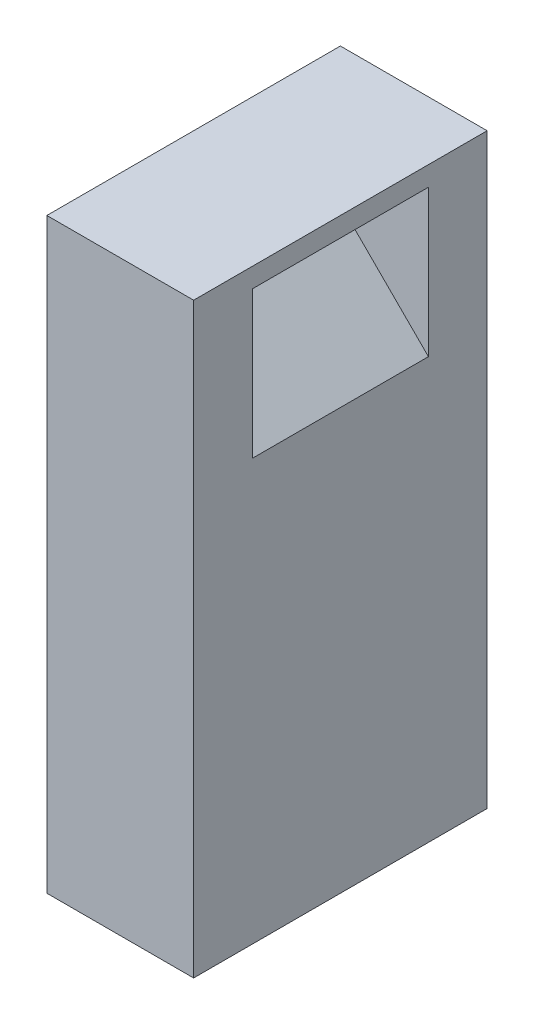
ISO-10303-21;
HEADER;
FILE_DESCRIPTION(('STEP AP214'),'2;1');
FILE_NAME('part.step','',(''),(''),'','','');
FILE_SCHEMA(('AUTOMOTIVE_DESIGN { 1 0 10303 214 1 1 1 1 }'));
ENDSEC;
DATA;
#1=APPLICATION_CONTEXT('core data for automotive mechanical design processes');
#2=APPLICATION_PROTOCOL_DEFINITION('international standard','automotive_design',2000,#1);
#3=PRODUCT_CONTEXT('',#1,'mechanical');
#4=PRODUCT('Part','Part','',(#3));
#5=PRODUCT_RELATED_PRODUCT_CATEGORY('part','',(#4));
#6=PRODUCT_DEFINITION_FORMATION('','',#4);
#7=PRODUCT_DEFINITION_CONTEXT('part definition',#1,'design');
#8=PRODUCT_DEFINITION('design','',#6,#7);
#9=PRODUCT_DEFINITION_SHAPE('','',#8);
#10=(LENGTH_UNIT() NAMED_UNIT(*) SI_UNIT(.MILLI.,.METRE.));
#11=(NAMED_UNIT(*) PLANE_ANGLE_UNIT() SI_UNIT($,.RADIAN.));
#12=(NAMED_UNIT(*) SI_UNIT($,.STERADIAN.) SOLID_ANGLE_UNIT());
#13=UNCERTAINTY_MEASURE_WITH_UNIT(LENGTH_MEASURE(1.E-05),#10,'distance_accuracy_value','');
#14=(GEOMETRIC_REPRESENTATION_CONTEXT(3) GLOBAL_UNCERTAINTY_ASSIGNED_CONTEXT((#13)) GLOBAL_UNIT_ASSIGNED_CONTEXT((#10,
#11,#12)) REPRESENTATION_CONTEXT('',''));
#15=CARTESIAN_POINT('',(0.,0.,0.));
#16=DIRECTION('',(0.,0.,1.));
#17=DIRECTION('',(1.,0.,0.));
#18=AXIS2_PLACEMENT_3D('',#15,#16,#17);
#19=CARTESIAN_POINT('',(75.,0.,75.));
#20=DIRECTION('',(-1.,0.,0.));
#21=DIRECTION('',(0.,0.,1.));
#22=AXIS2_PLACEMENT_3D('',#19,#20,#21);
#23=PLANE('',#22);
#24=DIRECTION('',(0.,1.,0.));
#25=VECTOR('',#24,1.);
#26=CARTESIAN_POINT('',(75.,0.,-75.));
#27=LINE('',#26,#25);
#28=CARTESIAN_POINT('',(75.,0.,-75.));
#29=VERTEX_POINT('',#28);
#30=CARTESIAN_POINT('',(75.,300.,-75.));
#31=VERTEX_POINT('',#30);
#32=EDGE_CURVE('E161',#29,#31,#27,.T.);
#33=ORIENTED_EDGE('',*,*,#32,.T.);
#34=DIRECTION('',(0.,0.,-1.));
#35=VECTOR('',#34,1.);
#36=CARTESIAN_POINT('',(75.,300.,75.));
#37=LINE('',#36,#35);
#38=CARTESIAN_POINT('',(75.,300.,75.));
#39=VERTEX_POINT('',#38);
#40=EDGE_CURVE('E169',#39,#31,#37,.T.);
#41=ORIENTED_EDGE('',*,*,#40,.F.);
#42=DIRECTION('',(0.,1.,0.));
#43=VECTOR('',#42,1.);
#44=CARTESIAN_POINT('',(75.,0.,75.));
#45=LINE('',#44,#43);
#46=CARTESIAN_POINT('',(75.,0.,75.));
#47=VERTEX_POINT('',#46);
#48=EDGE_CURVE('E148',#47,#39,#45,.T.);
#49=ORIENTED_EDGE('',*,*,#48,.F.);
#50=DIRECTION('',(0.,0.,-1.));
#51=VECTOR('',#50,1.);
#52=CARTESIAN_POINT('',(75.,0.,75.));
#53=LINE('',#52,#51);
#54=EDGE_CURVE('E53',#47,#29,#53,.T.);
#55=ORIENTED_EDGE('',*,*,#54,.T.);
#56=EDGE_LOOP('',(#33,#41,#49,#55));
#57=FACE_BOUND('',#56,.T.);
#58=DIRECTION('',(0.,1.,0.));
#59=VECTOR('',#58,1.);
#60=CARTESIAN_POINT('',(75.,290.,-45.));
#61=LINE('',#60,#59);
#62=CARTESIAN_POINT('',(75.,215.,-45.));
#63=VERTEX_POINT('',#62);
#64=CARTESIAN_POINT('',(75.,290.,-45.));
#65=VERTEX_POINT('',#64);
#66=EDGE_CURVE('E128',#63,#65,#61,.T.);
#67=ORIENTED_EDGE('',*,*,#66,.F.);
#68=DIRECTION('',(0.,0.,1.));
#69=VECTOR('',#68,1.);
#70=CARTESIAN_POINT('',(75.,215.,-45.));
#71=LINE('',#70,#69);
#72=CARTESIAN_POINT('',(75.,215.,45.));
#73=VERTEX_POINT('',#72);
#74=EDGE_CURVE('E139',#63,#73,#71,.T.);
#75=ORIENTED_EDGE('',*,*,#74,.T.);
#76=DIRECTION('',(0.,1.,0.));
#77=VECTOR('',#76,1.);
#78=CARTESIAN_POINT('',(75.,290.,45.));
#79=LINE('',#78,#77);
#80=CARTESIAN_POINT('',(75.,290.,45.));
#81=VERTEX_POINT('',#80);
#82=EDGE_CURVE('E134',#73,#81,#79,.T.);
#83=ORIENTED_EDGE('',*,*,#82,.T.);
#84=DIRECTION('',(0.,0.,1.));
#85=VECTOR('',#84,1.);
#86=CARTESIAN_POINT('',(75.,290.,-45.));
#87=LINE('',#86,#85);
#88=EDGE_CURVE('E116',#65,#81,#87,.T.);
#89=ORIENTED_EDGE('',*,*,#88,.F.);
#90=EDGE_LOOP('',(#67,#75,#83,#89));
#91=FACE_BOUND('',#90,.T.);
#92=ADVANCED_FACE('F44',(#57,#91),#23,.F.);
#93=CARTESIAN_POINT('',(0.,0.,75.));
#94=DIRECTION('',(1.,0.,0.));
#95=DIRECTION('',(0.,0.,-1.));
#96=AXIS2_PLACEMENT_3D('',#93,#94,#95);
#97=PLANE('',#96);
#98=DIRECTION('',(0.,-1.,0.));
#99=VECTOR('',#98,1.);
#100=CARTESIAN_POINT('',(0.,0.,-75.));
#101=LINE('',#100,#99);
#102=CARTESIAN_POINT('',(0.,300.,-75.));
#103=VERTEX_POINT('',#102);
#104=CARTESIAN_POINT('',(0.,0.,-75.));
#105=VERTEX_POINT('',#104);
#106=EDGE_CURVE('E157',#103,#105,#101,.T.);
#107=ORIENTED_EDGE('',*,*,#106,.T.);
#108=DIRECTION('',(0.,0.,-1.));
#109=VECTOR('',#108,1.);
#110=CARTESIAN_POINT('',(0.,0.,75.));
#111=LINE('',#110,#109);
#112=CARTESIAN_POINT('',(0.,0.,75.));
#113=VERTEX_POINT('',#112);
#114=EDGE_CURVE('E11',#113,#105,#111,.T.);
#115=ORIENTED_EDGE('',*,*,#114,.F.);
#116=DIRECTION('',(0.,-1.,0.));
#117=VECTOR('',#116,1.);
#118=CARTESIAN_POINT('',(0.,0.,75.));
#119=LINE('',#118,#117);
#120=CARTESIAN_POINT('',(0.,300.,75.));
#121=VERTEX_POINT('',#120);
#122=EDGE_CURVE('E144',#121,#113,#119,.T.);
#123=ORIENTED_EDGE('',*,*,#122,.F.);
#124=DIRECTION('',(0.,0.,-1.));
#125=VECTOR('',#124,1.);
#126=CARTESIAN_POINT('',(0.,300.,75.));
#127=LINE('',#126,#125);
#128=EDGE_CURVE('E154',#121,#103,#127,.T.);
#129=ORIENTED_EDGE('',*,*,#128,.T.);
#130=EDGE_LOOP('',(#107,#115,#123,#129));
#131=FACE_BOUND('',#130,.T.);
#132=ADVANCED_FACE('F50',(#131),#97,.F.);
#133=CARTESIAN_POINT('',(0.,0.,75.));
#134=DIRECTION('',(0.,1.,0.));
#135=DIRECTION('',(0.,0.,1.));
#136=AXIS2_PLACEMENT_3D('',#133,#134,#135);
#137=PLANE('',#136);
#138=DIRECTION('',(1.,0.,0.));
#139=VECTOR('',#138,1.);
#140=CARTESIAN_POINT('',(0.,0.,-75.));
#141=LINE('',#140,#139);
#142=EDGE_CURVE('E158',#105,#29,#141,.T.);
#143=ORIENTED_EDGE('',*,*,#142,.T.);
#144=ORIENTED_EDGE('',*,*,#54,.F.);
#145=DIRECTION('',(1.,0.,0.));
#146=VECTOR('',#145,1.);
#147=CARTESIAN_POINT('',(0.,0.,75.));
#148=LINE('',#147,#146);
#149=EDGE_CURVE('E97',#113,#47,#148,.T.);
#150=ORIENTED_EDGE('',*,*,#149,.F.);
#151=ORIENTED_EDGE('',*,*,#114,.T.);
#152=EDGE_LOOP('',(#143,#144,#150,#151));
#153=FACE_BOUND('',#152,.T.);
#154=ADVANCED_FACE('F190',(#153),#137,.F.);
#155=CARTESIAN_POINT('',(0.,300.,75.));
#156=DIRECTION('',(0.,-1.,0.));
#157=DIRECTION('',(0.,0.,-1.));
#158=AXIS2_PLACEMENT_3D('',#155,#156,#157);
#159=PLANE('',#158);
#160=DIRECTION('',(-1.,0.,0.));
#161=VECTOR('',#160,1.);
#162=CARTESIAN_POINT('',(0.,300.,-75.));
#163=LINE('',#162,#161);
#164=EDGE_CURVE('E91',#31,#103,#163,.T.);
#165=ORIENTED_EDGE('',*,*,#164,.T.);
#166=ORIENTED_EDGE('',*,*,#128,.F.);
#167=DIRECTION('',(-1.,0.,0.));
#168=VECTOR('',#167,1.);
#169=CARTESIAN_POINT('',(0.,300.,75.));
#170=LINE('',#169,#168);
#171=EDGE_CURVE('E68',#39,#121,#170,.T.);
#172=ORIENTED_EDGE('',*,*,#171,.F.);
#173=ORIENTED_EDGE('',*,*,#40,.T.);
#174=EDGE_LOOP('',(#165,#166,#172,#173));
#175=FACE_BOUND('',#174,.T.);
#176=ADVANCED_FACE('F182',(#175),#159,.F.);
#177=CARTESIAN_POINT('',(0.,0.,75.));
#178=DIRECTION('',(0.,0.,-1.));
#179=DIRECTION('',(-1.,0.,0.));
#180=AXIS2_PLACEMENT_3D('',#177,#178,#179);
#181=PLANE('',#180);
#182=ORIENTED_EDGE('',*,*,#122,.T.);
#183=ORIENTED_EDGE('',*,*,#149,.T.);
#184=ORIENTED_EDGE('',*,*,#48,.T.);
#185=ORIENTED_EDGE('',*,*,#171,.T.);
#186=EDGE_LOOP('',(#182,#183,#184,#185));
#187=FACE_BOUND('',#186,.T.);
#188=ADVANCED_FACE('F186',(#187),#181,.F.);
#189=CARTESIAN_POINT('',(0.,0.,-75.));
#190=DIRECTION('',(0.,0.,-1.));
#191=DIRECTION('',(-1.,0.,0.));
#192=AXIS2_PLACEMENT_3D('',#189,#190,#191);
#193=PLANE('',#192);
#194=ORIENTED_EDGE('',*,*,#106,.F.);
#195=ORIENTED_EDGE('',*,*,#164,.F.);
#196=ORIENTED_EDGE('',*,*,#32,.F.);
#197=ORIENTED_EDGE('',*,*,#142,.F.);
#198=EDGE_LOOP('',(#194,#195,#196,#197));
#199=FACE_BOUND('',#198,.T.);
#200=ADVANCED_FACE('F179',(#199),#193,.T.);
#201=CARTESIAN_POINT('',(37.5,252.5,-45.));
#202=DIRECTION('',(-0.707106781186546,-0.707106781186549,0.));
#203=DIRECTION('',(0.707106781186549,-0.707106781186546,0.));
#204=AXIS2_PLACEMENT_3D('',#201,#202,#203);
#205=PLANE('',#204);
#206=DIRECTION('',(0.707106781186549,-0.707106781186546,0.));
#207=VECTOR('',#206,1.);
#208=CARTESIAN_POINT('',(37.5,252.5,45.));
#209=LINE('',#208,#207);
#210=CARTESIAN_POINT('',(37.5,252.5,45.));
#211=VERTEX_POINT('',#210);
#212=EDGE_CURVE('E133',#211,#73,#209,.T.);
#213=ORIENTED_EDGE('',*,*,#212,.T.);
#214=ORIENTED_EDGE('',*,*,#74,.F.);
#215=DIRECTION('',(0.707106781186549,-0.707106781186546,0.));
#216=VECTOR('',#215,1.);
#217=CARTESIAN_POINT('',(37.5,252.5,-45.));
#218=LINE('',#217,#216);
#219=CARTESIAN_POINT('',(37.5,252.5,-45.));
#220=VERTEX_POINT('',#219);
#221=EDGE_CURVE('E124',#220,#63,#218,.T.);
#222=ORIENTED_EDGE('',*,*,#221,.F.);
#223=DIRECTION('',(0.,0.,1.));
#224=VECTOR('',#223,1.);
#225=CARTESIAN_POINT('',(37.5,252.5,-45.));
#226=LINE('',#225,#224);
#227=EDGE_CURVE('E119',#220,#211,#226,.T.);
#228=ORIENTED_EDGE('',*,*,#227,.T.);
#229=EDGE_LOOP('',(#213,#214,#222,#228));
#230=FACE_BOUND('',#229,.T.);
#231=ADVANCED_FACE('F228',(#230),#205,.F.);
#232=CARTESIAN_POINT('',(75.,290.,-45.));
#233=DIRECTION('',(-0.707106781186549,0.707106781186546,0.));
#234=DIRECTION('',(-0.707106781186546,-0.707106781186549,0.));
#235=AXIS2_PLACEMENT_3D('',#232,#233,#234);
#236=PLANE('',#235);
#237=DIRECTION('',(-0.707106781186546,-0.707106781186549,0.));
#238=VECTOR('',#237,1.);
#239=CARTESIAN_POINT('',(75.,290.,45.));
#240=LINE('',#239,#238);
#241=EDGE_CURVE('E63',#81,#211,#240,.T.);
#242=ORIENTED_EDGE('',*,*,#241,.T.);
#243=ORIENTED_EDGE('',*,*,#227,.F.);
#244=DIRECTION('',(-0.707106781186546,-0.707106781186549,0.));
#245=VECTOR('',#244,1.);
#246=CARTESIAN_POINT('',(75.,290.,-45.));
#247=LINE('',#246,#245);
#248=EDGE_CURVE('E114',#65,#220,#247,.T.);
#249=ORIENTED_EDGE('',*,*,#248,.F.);
#250=ORIENTED_EDGE('',*,*,#88,.T.);
#251=EDGE_LOOP('',(#242,#243,#249,#250));
#252=FACE_BOUND('',#251,.T.);
#253=ADVANCED_FACE('F118',(#252),#236,.F.);
#254=CARTESIAN_POINT('',(0.,0.,-45.));
#255=DIRECTION('',(0.,0.,1.));
#256=DIRECTION('',(1.,0.,0.));
#257=AXIS2_PLACEMENT_3D('',#254,#255,#256);
#258=PLANE('',#257);
#259=ORIENTED_EDGE('',*,*,#66,.T.);
#260=ORIENTED_EDGE('',*,*,#248,.T.);
#261=ORIENTED_EDGE('',*,*,#221,.T.);
#262=EDGE_LOOP('',(#259,#260,#261));
#263=FACE_BOUND('',#262,.T.);
#264=ADVANCED_FACE('F129',(#263),#258,.T.);
#265=CARTESIAN_POINT('',(0.,0.,45.));
#266=DIRECTION('',(0.,0.,1.));
#267=DIRECTION('',(1.,0.,0.));
#268=AXIS2_PLACEMENT_3D('',#265,#266,#267);
#269=PLANE('',#268);
#270=ORIENTED_EDGE('',*,*,#82,.F.);
#271=ORIENTED_EDGE('',*,*,#212,.F.);
#272=ORIENTED_EDGE('',*,*,#241,.F.);
#273=EDGE_LOOP('',(#270,#271,#272));
#274=FACE_BOUND('',#273,.T.);
#275=ADVANCED_FACE('F258',(#274),#269,.F.);
#276=CLOSED_SHELL('',(#92,#132,#154,#176,#188,#200,#231,#253,#264,#275));
#277=MANIFOLD_SOLID_BREP('B2',#276);
#278=ADVANCED_BREP_SHAPE_REPRESENTATION('',(#18,#277),#14);
#279=SHAPE_DEFINITION_REPRESENTATION(#9,#278);
ENDSEC;
END-ISO-10303-21;
